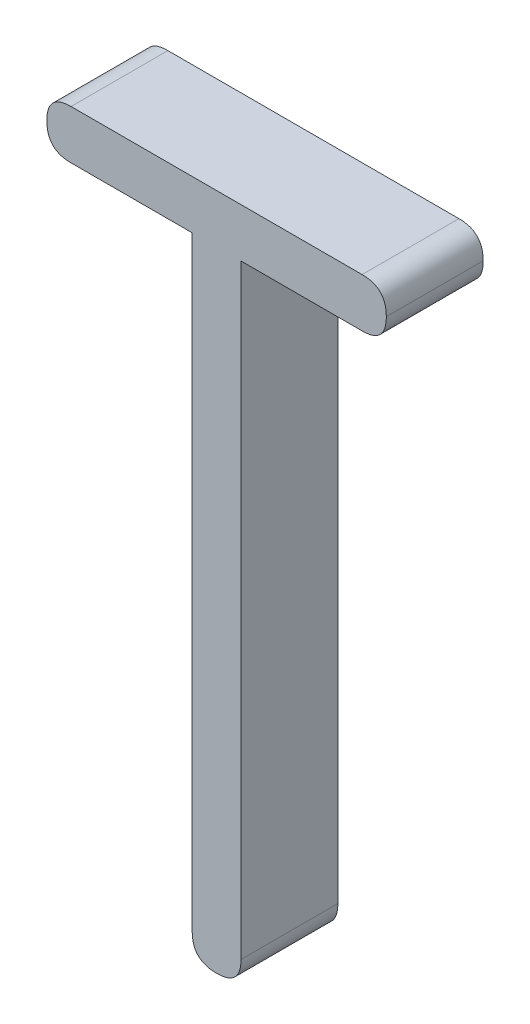
ISO-10303-21;
HEADER;
FILE_DESCRIPTION(('STEP AP214'),'2;1');
FILE_NAME('part.step','',(''),(''),'','','');
FILE_SCHEMA(('AUTOMOTIVE_DESIGN { 1 0 10303 214 1 1 1 1 }'));
ENDSEC;
DATA;
#1=APPLICATION_CONTEXT('core data for automotive mechanical design processes');
#2=APPLICATION_PROTOCOL_DEFINITION('international standard','automotive_design',2000,#1);
#3=PRODUCT_CONTEXT('',#1,'mechanical');
#4=PRODUCT('Part','Part','',(#3));
#5=PRODUCT_RELATED_PRODUCT_CATEGORY('part','',(#4));
#6=PRODUCT_DEFINITION_FORMATION('','',#4);
#7=PRODUCT_DEFINITION_CONTEXT('part definition',#1,'design');
#8=PRODUCT_DEFINITION('design','',#6,#7);
#9=PRODUCT_DEFINITION_SHAPE('','',#8);
#10=(LENGTH_UNIT() NAMED_UNIT(*) SI_UNIT(.MILLI.,.METRE.));
#11=(NAMED_UNIT(*) PLANE_ANGLE_UNIT() SI_UNIT($,.RADIAN.));
#12=(NAMED_UNIT(*) SI_UNIT($,.STERADIAN.) SOLID_ANGLE_UNIT());
#13=UNCERTAINTY_MEASURE_WITH_UNIT(LENGTH_MEASURE(1.E-05),#10,'distance_accuracy_value','');
#14=(GEOMETRIC_REPRESENTATION_CONTEXT(3) GLOBAL_UNCERTAINTY_ASSIGNED_CONTEXT((#13)) GLOBAL_UNIT_ASSIGNED_CONTEXT((#10,
#11,#12)) REPRESENTATION_CONTEXT('',''));
#15=CARTESIAN_POINT('',(0.,0.,0.));
#16=DIRECTION('',(0.,0.,1.));
#17=DIRECTION('',(1.,0.,0.));
#18=AXIS2_PLACEMENT_3D('',#15,#16,#17);
#19=CARTESIAN_POINT('',(20.9517277553988,2.3533999175906,-0.1));
#20=CARTESIAN_POINT('',(20.9517277553988,2.3785999175906,-0.1));
#21=CARTESIAN_POINT('',(20.9267202553988,2.3785999175906,-0.1));
#22=CARTESIAN_POINT('',(20.9517277553988,2.3533999175906,0.));
#23=CARTESIAN_POINT('',(20.9517277553988,2.3785999175906,0.));
#24=CARTESIAN_POINT('',(20.9267202553988,2.3785999175906,0.));
#25=B_SPLINE_SURFACE_WITH_KNOTS('',1,2,((#19,#20,#21),(#22,#23,#24)),.UNSPECIFIED.,.F.,.F.,.F.,
(2,2),(3,3),(0.,1.),(0.,1.),.UNSPECIFIED.);
#26=DIRECTION('',(0.,0.,-1.));
#27=VECTOR('',#26,1.);
#28=CARTESIAN_POINT('',(20.9517277553988,2.3533999175906,-0.05));
#29=LINE('',#28,#27);
#30=CARTESIAN_POINT('',(20.9517277553988,2.3533999175906,0.));
#31=VERTEX_POINT('',#30);
#32=CARTESIAN_POINT('',(20.9517277553988,2.3533999175906,-0.1));
#33=VERTEX_POINT('',#32);
#34=EDGE_CURVE('E111',#31,#33,#29,.T.);
#35=CARTESIAN_POINT('',(20.9517277553988,2.3533999175906,-0.1));
#36=CARTESIAN_POINT('',(20.9517188563615,2.35549240841371,-0.1));
#37=CARTESIAN_POINT('',(20.9515957631418,2.35761873987553,-0.1));
#38=CARTESIAN_POINT('',(20.9509511596031,2.36185217443173,-0.1));
#39=CARTESIAN_POINT('',(20.9504209706376,2.36395783308257,-0.1));
#40=CARTESIAN_POINT('',(20.9487923133418,2.36792403216964,-0.1));
#41=CARTESIAN_POINT('',(20.9477040424521,2.36978824360614,-0.1));
#42=CARTESIAN_POINT('',(20.9449165360134,2.37300951685075,-0.1));
#43=CARTESIAN_POINT('',(20.9432149871706,2.37436461821947,-0.1));
#44=CARTESIAN_POINT('',(20.9390808376657,2.37668119133859,-0.1));
#45=CARTESIAN_POINT('',(20.9365698138118,2.37748805054711,-0.1));
#46=CARTESIAN_POINT('',(20.9315797217488,2.37842491467146,-0.1));
#47=CARTESIAN_POINT('',(20.929108807879,2.3785947631296,-0.1));
#48=CARTESIAN_POINT('',(20.9267202553988,2.3785999175906,-0.1));
#49=B_SPLINE_CURVE_WITH_KNOTS('',3,(#35,#36,#37,#38,#39,#40,#41,#42,#43,#44,#45,#46,#47,#48),
.UNSPECIFIED.,.F.,.F.,(4,2,2,2,2,2,4),(0.,0.0063286558976897,0.0127961082036592,
0.019149386352186,0.0255268843609786,0.0333230170829277,0.0406225102328537),.UNSPECIFIED.);
#50=CARTESIAN_POINT('',(20.9267202553988,2.3785999175906,-0.1));
#51=VERTEX_POINT('',#50);
#52=EDGE_CURVE('E191',#33,#51,#49,.T.);
#53=DIRECTION('',(0.,0.,1.));
#54=VECTOR('',#53,1.);
#55=CARTESIAN_POINT('',(20.9267202553988,2.3785999175906,-0.1));
#56=LINE('',#55,#54);
#57=CARTESIAN_POINT('',(20.9267202553988,2.3785999175906,0.));
#58=VERTEX_POINT('',#57);
#59=EDGE_CURVE('E151',#58,#51,#56,.F.);
#60=CARTESIAN_POINT('',(20.9517277553988,2.3533999175906,0.));
#61=CARTESIAN_POINT('',(20.9517188563615,2.35549240841372,0.));
#62=CARTESIAN_POINT('',(20.9515957631418,2.35761873987553,0.));
#63=CARTESIAN_POINT('',(20.9509511596031,2.36185217443173,0.));
#64=CARTESIAN_POINT('',(20.9504209706376,2.36395783308257,0.));
#65=CARTESIAN_POINT('',(20.9487923133418,2.36792403216964,0.));
#66=CARTESIAN_POINT('',(20.9477040424521,2.36978824360614,0.));
#67=CARTESIAN_POINT('',(20.9449165360134,2.37300951685075,0.));
#68=CARTESIAN_POINT('',(20.9432149871706,2.37436461821947,0.));
#69=CARTESIAN_POINT('',(20.9390808376657,2.37668119133859,0.));
#70=CARTESIAN_POINT('',(20.9365698138118,2.37748805054711,0.));
#71=CARTESIAN_POINT('',(20.9315797217488,2.37842491467146,0.));
#72=CARTESIAN_POINT('',(20.929108807879,2.3785947631296,0.));
#73=CARTESIAN_POINT('',(20.9267202553988,2.3785999175906,0.));
#74=B_SPLINE_CURVE_WITH_KNOTS('',3,(#60,#61,#62,#63,#64,#65,#66,#67,#68,#69,#70,#71,#72,#73),
.UNSPECIFIED.,.F.,.F.,(4,2,2,2,2,2,4),(0.,0.00632865589769069,0.0127961082036612,
0.019149386352188,0.0255268843609806,0.0333230170829297,0.0406225102328557),.UNSPECIFIED.);
#75=EDGE_CURVE('E115',#31,#58,#74,.T.);
#76=ORIENTED_EDGE('',*,*,#34,.T.);
#77=ORIENTED_EDGE('',*,*,#52,.T.);
#78=ORIENTED_EDGE('',*,*,#59,.F.);
#79=ORIENTED_EDGE('',*,*,#75,.F.);
#80=EDGE_LOOP('',(#76,#77,#78,#79));
#81=FACE_BOUND('',#80,.T.);
#82=ADVANCED_FACE('F17',(#81),#25,.F.);
#83=CARTESIAN_POINT('',(20.9267202553988,2.3785999175906,-0.1));
#84=DIRECTION('',(0.,1.,0.));
#85=DIRECTION('',(0.,0.,1.));
#86=AXIS2_PLACEMENT_3D('',#83,#84,#85);
#87=PLANE('',#86);
#88=DIRECTION('',(1.,0.,0.));
#89=VECTOR('',#88,1.);
#90=CARTESIAN_POINT('',(0.,2.3785999175906,-0.1));
#91=LINE('',#90,#89);
#92=CARTESIAN_POINT('',(20.6261752553988,2.3785999175906,-0.1));
#93=VERTEX_POINT('',#92);
#94=EDGE_CURVE('E196',#51,#93,#91,.F.);
#95=ORIENTED_EDGE('',*,*,#94,.T.);
#96=DIRECTION('',(0.,0.,1.));
#97=VECTOR('',#96,1.);
#98=CARTESIAN_POINT('',(20.6261752553988,2.3785999175906,-0.05));
#99=LINE('',#98,#97);
#100=CARTESIAN_POINT('',(20.6261752553988,2.3785999175906,0.));
#101=VERTEX_POINT('',#100);
#102=EDGE_CURVE('E149',#93,#101,#99,.T.);
#103=ORIENTED_EDGE('',*,*,#102,.T.);
#104=DIRECTION('',(1.,0.,0.));
#105=VECTOR('',#104,1.);
#106=CARTESIAN_POINT('',(0.,2.3785999175906,0.));
#107=LINE('',#106,#105);
#108=EDGE_CURVE('E224',#58,#101,#107,.F.);
#109=ORIENTED_EDGE('',*,*,#108,.F.);
#110=ORIENTED_EDGE('',*,*,#59,.T.);
#111=EDGE_LOOP('',(#95,#103,#109,#110));
#112=FACE_BOUND('',#111,.T.);
#113=ADVANCED_FACE('F207',(#112),#87,.T.);
#114=CARTESIAN_POINT('',(20.6261752553988,2.3785999175906,-0.1));
#115=CARTESIAN_POINT('',(20.6011677553988,2.3785999175906,-0.1));
#116=CARTESIAN_POINT('',(20.6011677553988,2.3533999175906,-0.1));
#117=CARTESIAN_POINT('',(20.6261752553988,2.3785999175906,0.));
#118=CARTESIAN_POINT('',(20.6011677553988,2.3785999175906,0.));
#119=CARTESIAN_POINT('',(20.6011677553988,2.3533999175906,0.));
#120=B_SPLINE_SURFACE_WITH_KNOTS('',1,2,((#114,#115,#116),(#117,#118,#119)),.UNSPECIFIED.,.F.,
.F.,.F.,(2,2),(3,3),(0.,1.),(0.,1.),.UNSPECIFIED.);
#121=CARTESIAN_POINT('',(20.6261752553988,2.3785999175906,-0.1));
#122=CARTESIAN_POINT('',(20.6241322754824,2.37859176818425,-0.1));
#123=CARTESIAN_POINT('',(20.6220581548315,2.37847130446838,-0.1));
#124=CARTESIAN_POINT('',(20.6179293023062,2.37784575233803,-0.1));
#125=CARTESIAN_POINT('',(20.6158759011217,2.37733260848162,-0.1));
#126=CARTESIAN_POINT('',(20.6119543753392,2.37574360496876,-0.1));
#127=CARTESIAN_POINT('',(20.6100875349692,2.37466412725201,-0.1));
#128=CARTESIAN_POINT('',(20.6068581819807,2.37189321234206,-0.1));
#129=CARTESIAN_POINT('',(20.6054975685729,2.37019951677084,-0.1));
#130=CARTESIAN_POINT('',(20.6031578137197,2.36607204776629,-0.1));
#131=CARTESIAN_POINT('',(20.6023361288653,2.36355757373418,-0.1));
#132=CARTESIAN_POINT('',(20.601353110353,2.35846230530187,-0.1));
#133=CARTESIAN_POINT('',(20.6011740719858,2.35588529185247,-0.1));
#134=CARTESIAN_POINT('',(20.6011677553988,2.3533999175906,-0.1));
#135=B_SPLINE_CURVE_WITH_KNOTS('',3,(#121,#122,#123,#124,#125,#126,#127,#128,#129,#130,#131,
#132,#133,#134),.UNSPECIFIED.,.F.,.F.,(4,2,2,2,2,2,4),(0.,0.00617555295361581,
0.0124813041899388,0.0188278396858581,0.025197950950079,0.0330188630002677,0.0406225830086296),.UNSPECIFIED.);
#136=CARTESIAN_POINT('',(20.6011677553988,2.3533999175906,-0.1));
#137=VERTEX_POINT('',#136);
#138=EDGE_CURVE('E185',#93,#137,#135,.T.);
#139=DIRECTION('',(0.,0.,1.));
#140=VECTOR('',#139,1.);
#141=CARTESIAN_POINT('',(20.6011677553988,2.3533999175906,-0.05));
#142=LINE('',#141,#140);
#143=CARTESIAN_POINT('',(20.6011677553988,2.3533999175906,0.));
#144=VERTEX_POINT('',#143);
#145=EDGE_CURVE('E147',#137,#144,#142,.T.);
#146=CARTESIAN_POINT('',(20.6261752553988,2.3785999175906,0.));
#147=CARTESIAN_POINT('',(20.6241322754824,2.37859176818425,0.));
#148=CARTESIAN_POINT('',(20.6220581548315,2.37847130446838,0.));
#149=CARTESIAN_POINT('',(20.6179293023062,2.37784575233803,0.));
#150=CARTESIAN_POINT('',(20.6158759011217,2.37733260848162,0.));
#151=CARTESIAN_POINT('',(20.6119543753392,2.37574360496876,0.));
#152=CARTESIAN_POINT('',(20.6100875349692,2.37466412725201,0.));
#153=CARTESIAN_POINT('',(20.6068581819807,2.37189321234206,0.));
#154=CARTESIAN_POINT('',(20.6054975685729,2.37019951677084,0.));
#155=CARTESIAN_POINT('',(20.6031578137197,2.36607204776629,0.));
#156=CARTESIAN_POINT('',(20.6023361288653,2.36355757373418,0.));
#157=CARTESIAN_POINT('',(20.601353110353,2.35846230530187,0.));
#158=CARTESIAN_POINT('',(20.6011740719858,2.35588529185247,0.));
#159=CARTESIAN_POINT('',(20.6011677553988,2.3533999175906,0.));
#160=B_SPLINE_CURVE_WITH_KNOTS('',3,(#146,#147,#148,#149,#150,#151,#152,#153,#154,#155,#156,
#157,#158,#159),.UNSPECIFIED.,.F.,.F.,(4,2,2,2,2,2,4),(0.,0.00617555295361581,
0.0124813041899388,0.0188278396858581,0.025197950950079,0.0330188630002677,0.0406225830086296),.UNSPECIFIED.);
#161=EDGE_CURVE('E225',#101,#144,#160,.T.);
#162=ORIENTED_EDGE('',*,*,#102,.F.);
#163=ORIENTED_EDGE('',*,*,#138,.T.);
#164=ORIENTED_EDGE('',*,*,#145,.T.);
#165=ORIENTED_EDGE('',*,*,#161,.F.);
#166=EDGE_LOOP('',(#162,#163,#164,#165));
#167=FACE_BOUND('',#166,.T.);
#168=ADVANCED_FACE('F210',(#167),#120,.F.);
#169=CARTESIAN_POINT('',(20.6011677553988,2.3533999175906,-0.1));
#170=CARTESIAN_POINT('',(20.6011677553988,2.3281999175906,-0.1));
#171=CARTESIAN_POINT('',(20.6261052553988,2.3281999175906,-0.1));
#172=CARTESIAN_POINT('',(20.6011677553988,2.3533999175906,0.));
#173=CARTESIAN_POINT('',(20.6011677553988,2.3281999175906,0.));
#174=CARTESIAN_POINT('',(20.6261052553988,2.3281999175906,0.));
#175=B_SPLINE_SURFACE_WITH_KNOTS('',1,2,((#169,#170,#171),(#172,#173,#174)),.UNSPECIFIED.,.F.,
.F.,.F.,(2,2),(3,3),(0.,1.),(0.,1.),.UNSPECIFIED.);
#176=CARTESIAN_POINT('',(20.6011677553988,2.3533999175906,-0.1));
#177=CARTESIAN_POINT('',(20.6011767864963,2.35130121936063,-0.1));
#178=CARTESIAN_POINT('',(20.6013001871403,2.34916821054262,-0.1));
#179=CARTESIAN_POINT('',(20.6019474195651,2.34492135595703,-0.1));
#180=CARTESIAN_POINT('',(20.6024800371272,2.34280897447728,-0.1));
#181=CARTESIAN_POINT('',(20.6041137783035,2.33884018267279,-0.1));
#182=CARTESIAN_POINT('',(20.6052021167657,2.33697915780581,-0.1));
#183=CARTESIAN_POINT('',(20.6079886846106,2.33376405372838,-0.1));
#184=CARTESIAN_POINT('',(20.6096892336299,2.33241194317563,-0.1));
#185=CARTESIAN_POINT('',(20.6138187090784,2.33010296648838,-0.1));
#186=CARTESIAN_POINT('',(20.6163255383305,2.32929998506332,-0.1));
#187=CARTESIAN_POINT('',(20.6212894576872,2.32837279641824,-0.1));
#188=CARTESIAN_POINT('',(20.6237376721328,2.32820487092749,-0.1));
#189=CARTESIAN_POINT('',(20.6261052553988,2.3281999175906,-0.1));
#190=B_SPLINE_CURVE_WITH_KNOTS('',3,(#176,#177,#178,#179,#180,#181,#182,#183,#184,#185,#186,
#187,#188,#189),.UNSPECIFIED.,.F.,.F.,(4,2,2,2,2,2,4),(0.,0.00634808488667877,
0.0128364065694494,0.019181763416515,0.0255514200174723,0.0333319586615247,0.0405659536964663),.UNSPECIFIED.);
#191=CARTESIAN_POINT('',(20.6261052553988,2.3281999175906,-0.1));
#192=VERTEX_POINT('',#191);
#193=EDGE_CURVE('E179',#137,#192,#190,.T.);
#194=DIRECTION('',(0.,0.,-1.));
#195=VECTOR('',#194,1.);
#196=CARTESIAN_POINT('',(20.6261052553988,2.3281999175906,-0.1));
#197=LINE('',#196,#195);
#198=CARTESIAN_POINT('',(20.6261052553988,2.3281999175906,0.));
#199=VERTEX_POINT('',#198);
#200=EDGE_CURVE('E142',#199,#192,#197,.T.);
#201=CARTESIAN_POINT('',(20.6011677553988,2.3533999175906,0.));
#202=CARTESIAN_POINT('',(20.6011767864963,2.35130121936063,0.));
#203=CARTESIAN_POINT('',(20.6013001871403,2.34916821054262,0.));
#204=CARTESIAN_POINT('',(20.6019474195651,2.34492135595703,0.));
#205=CARTESIAN_POINT('',(20.6024800371272,2.34280897447728,0.));
#206=CARTESIAN_POINT('',(20.6041137783035,2.33884018267279,0.));
#207=CARTESIAN_POINT('',(20.6052021167657,2.33697915780581,0.));
#208=CARTESIAN_POINT('',(20.6079886846106,2.33376405372838,0.));
#209=CARTESIAN_POINT('',(20.6096892336299,2.33241194317563,0.));
#210=CARTESIAN_POINT('',(20.6138187090784,2.33010296648838,0.));
#211=CARTESIAN_POINT('',(20.6163255383305,2.32929998506332,0.));
#212=CARTESIAN_POINT('',(20.6212894576872,2.32837279641824,0.));
#213=CARTESIAN_POINT('',(20.6237376721328,2.32820487092749,0.));
#214=CARTESIAN_POINT('',(20.6261052553988,2.3281999175906,0.));
#215=B_SPLINE_CURVE_WITH_KNOTS('',3,(#201,#202,#203,#204,#205,#206,#207,#208,#209,#210,#211,
#212,#213,#214),.UNSPECIFIED.,.F.,.F.,(4,2,2,2,2,2,4),(0.,0.00634808488667896,0.01283640656945,
0.0191817634165157,0.025551420017473,0.0333319586615254,0.0405659536964669),.UNSPECIFIED.);
#216=EDGE_CURVE('E231',#144,#199,#215,.T.);
#217=ORIENTED_EDGE('',*,*,#145,.F.);
#218=ORIENTED_EDGE('',*,*,#193,.T.);
#219=ORIENTED_EDGE('',*,*,#200,.F.);
#220=ORIENTED_EDGE('',*,*,#216,.F.);
#221=EDGE_LOOP('',(#217,#218,#219,#220));
#222=FACE_BOUND('',#221,.T.);
#223=ADVANCED_FACE('F241',(#222),#175,.F.);
#224=CARTESIAN_POINT('',(20.6261052553988,2.3281999175906,-0.1));
#225=DIRECTION('',(0.,-1.,0.));
#226=DIRECTION('',(0.,0.,-1.));
#227=AXIS2_PLACEMENT_3D('',#224,#225,#226);
#228=PLANE('',#227);
#229=DIRECTION('',(1.,0.,0.));
#230=VECTOR('',#229,1.);
#231=CARTESIAN_POINT('',(0.,2.3281999175906,-0.1));
#232=LINE('',#231,#230);
#233=CARTESIAN_POINT('',(20.7512477553988,2.3281999175906,-0.1));
#234=VERTEX_POINT('',#233);
#235=EDGE_CURVE('E327',#192,#234,#232,.T.);
#236=ORIENTED_EDGE('',*,*,#235,.T.);
#237=DIRECTION('',(0.,0.,1.));
#238=VECTOR('',#237,1.);
#239=CARTESIAN_POINT('',(20.7512477553988,2.3281999175906,-0.1));
#240=LINE('',#239,#238);
#241=CARTESIAN_POINT('',(20.7512477553988,2.3281999175906,0.));
#242=VERTEX_POINT('',#241);
#243=EDGE_CURVE('E139',#242,#234,#240,.F.);
#244=ORIENTED_EDGE('',*,*,#243,.F.);
#245=DIRECTION('',(1.,0.,0.));
#246=VECTOR('',#245,1.);
#247=CARTESIAN_POINT('',(0.,2.3281999175906,0.));
#248=LINE('',#247,#246);
#249=EDGE_CURVE('E237',#199,#242,#248,.T.);
#250=ORIENTED_EDGE('',*,*,#249,.F.);
#251=ORIENTED_EDGE('',*,*,#200,.T.);
#252=EDGE_LOOP('',(#236,#244,#250,#251));
#253=FACE_BOUND('',#252,.T.);
#254=ADVANCED_FACE('F246',(#253),#228,.T.);
#255=CARTESIAN_POINT('',(20.7512477553988,2.3281999175906,-0.1));
#256=DIRECTION('',(-1.,0.,0.));
#257=DIRECTION('',(0.,0.,1.));
#258=AXIS2_PLACEMENT_3D('',#255,#256,#257);
#259=PLANE('',#258);
#260=DIRECTION('',(0.,1.,0.));
#261=VECTOR('',#260,1.);
#262=CARTESIAN_POINT('',(20.7512477553988,0.,-0.1));
#263=LINE('',#262,#261);
#264=CARTESIAN_POINT('',(20.7512477553988,1.7035899175906,-0.1));
#265=VERTEX_POINT('',#264);
#266=EDGE_CURVE('E332',#234,#265,#263,.F.);
#267=ORIENTED_EDGE('',*,*,#266,.T.);
#268=DIRECTION('',(0.,0.,1.));
#269=VECTOR('',#268,1.);
#270=CARTESIAN_POINT('',(20.7512477553988,1.7035899175906,-0.05));
#271=LINE('',#270,#269);
#272=CARTESIAN_POINT('',(20.7512477553988,1.7035899175906,0.));
#273=VERTEX_POINT('',#272);
#274=EDGE_CURVE('E137',#265,#273,#271,.T.);
#275=ORIENTED_EDGE('',*,*,#274,.T.);
#276=DIRECTION('',(0.,1.,0.));
#277=VECTOR('',#276,1.);
#278=CARTESIAN_POINT('',(20.7512477553988,0.,0.));
#279=LINE('',#278,#277);
#280=EDGE_CURVE('E303',#242,#273,#279,.F.);
#281=ORIENTED_EDGE('',*,*,#280,.F.);
#282=ORIENTED_EDGE('',*,*,#243,.T.);
#283=EDGE_LOOP('',(#267,#275,#281,#282));
#284=FACE_BOUND('',#283,.T.);
#285=ADVANCED_FACE('F259',(#284),#259,.T.);
#286=CARTESIAN_POINT('',(20.7512477553988,1.7035899175906,-0.1));
#287=CARTESIAN_POINT('',(20.7512477553988,1.6785999175906,-0.1));
#288=CARTESIAN_POINT('',(20.7764477553988,1.6785999175906,-0.1));
#289=CARTESIAN_POINT('',(20.7512477553988,1.7035899175906,0.));
#290=CARTESIAN_POINT('',(20.7512477553988,1.6785999175906,0.));
#291=CARTESIAN_POINT('',(20.7764477553988,1.6785999175906,0.));
#292=B_SPLINE_SURFACE_WITH_KNOTS('',1,2,((#286,#287,#288),(#289,#290,#291)),.UNSPECIFIED.,.F.,
.F.,.F.,(2,2),(3,3),(0.,1.),(0.,1.),.UNSPECIFIED.);
#293=CARTESIAN_POINT('',(20.7512477553988,1.7035899175906,-0.1));
#294=CARTESIAN_POINT('',(20.7512558693878,1.7015498893279,-0.1));
#295=CARTESIAN_POINT('',(20.7513761709987,1.6994788491768,-0.1));
#296=CARTESIAN_POINT('',(20.752000646894,1.69535615628181,-0.1));
#297=CARTESIAN_POINT('',(20.7525128465457,1.69330582880643,-0.1));
#298=CARTESIAN_POINT('',(20.7540995122263,1.68938771504422,-0.1));
#299=CARTESIAN_POINT('',(20.7551782079979,1.68752142914264,-0.1));
#300=CARTESIAN_POINT('',(20.7579473821896,1.68429287782701,-0.1));
#301=CARTESIAN_POINT('',(20.7596401155965,1.68293250811998,-0.1));
#302=CARTESIAN_POINT('',(20.7637658122251,1.68059254093057,-0.1));
#303=CARTESIAN_POINT('',(20.7662795528121,1.67977047631339,-0.1));
#304=CARTESIAN_POINT('',(20.7713778403898,1.67878568225118,-0.1));
#305=CARTESIAN_POINT('',(20.7739588220405,1.67860628918776,-0.1));
#306=CARTESIAN_POINT('',(20.7764477553988,1.6785999175906,-0.1));
#307=B_SPLINE_CURVE_WITH_KNOTS('',3,(#293,#294,#295,#296,#297,#298,#299,#300,#301,#302,#303,
#304,#305,#306),.UNSPECIFIED.,.F.,.F.,(4,2,2,2,2,2,4),(0.,0.00616648259272471,
0.0124627395857372,0.0188066903326243,0.0251741784016736,0.0329934495469082,0.0406084478282393),.UNSPECIFIED.);
#308=CARTESIAN_POINT('',(20.7764477553988,1.6785999175906,-0.1));
#309=VERTEX_POINT('',#308);
#310=EDGE_CURVE('E160',#265,#309,#307,.T.);
#311=DIRECTION('',(0.,0.,1.));
#312=VECTOR('',#311,1.);
#313=CARTESIAN_POINT('',(20.7764477553988,1.6785999175906,-0.05));
#314=LINE('',#313,#312);
#315=CARTESIAN_POINT('',(20.7764477553988,1.6785999175906,0.));
#316=VERTEX_POINT('',#315);
#317=EDGE_CURVE('E133',#309,#316,#314,.T.);
#318=CARTESIAN_POINT('',(20.7512477553988,1.7035899175906,0.));
#319=CARTESIAN_POINT('',(20.7512558693878,1.7015498893279,0.));
#320=CARTESIAN_POINT('',(20.7513761709987,1.6994788491768,0.));
#321=CARTESIAN_POINT('',(20.752000646894,1.69535615628181,0.));
#322=CARTESIAN_POINT('',(20.7525128465457,1.69330582880643,0.));
#323=CARTESIAN_POINT('',(20.7540995122263,1.68938771504422,0.));
#324=CARTESIAN_POINT('',(20.7551782079979,1.68752142914264,0.));
#325=CARTESIAN_POINT('',(20.7579473821896,1.68429287782701,0.));
#326=CARTESIAN_POINT('',(20.7596401155965,1.68293250811998,0.));
#327=CARTESIAN_POINT('',(20.7637658122251,1.68059254093057,0.));
#328=CARTESIAN_POINT('',(20.7662795528121,1.67977047631339,0.));
#329=CARTESIAN_POINT('',(20.7713778403898,1.67878568225118,0.));
#330=CARTESIAN_POINT('',(20.7739588220405,1.67860628918776,0.));
#331=CARTESIAN_POINT('',(20.7764477553988,1.6785999175906,0.));
#332=B_SPLINE_CURVE_WITH_KNOTS('',3,(#318,#319,#320,#321,#322,#323,#324,#325,#326,#327,#328,
#329,#330,#331),.UNSPECIFIED.,.F.,.F.,(4,2,2,2,2,2,4),(0.,0.00616648259272471,
0.0124627395857372,0.0188066903326243,0.0251741784016736,0.0329934495469082,0.0406084478282393),.UNSPECIFIED.);
#333=EDGE_CURVE('E136',#273,#316,#332,.T.);
#334=ORIENTED_EDGE('',*,*,#274,.F.);
#335=ORIENTED_EDGE('',*,*,#310,.T.);
#336=ORIENTED_EDGE('',*,*,#317,.T.);
#337=ORIENTED_EDGE('',*,*,#333,.F.);
#338=EDGE_LOOP('',(#334,#335,#336,#337));
#339=FACE_BOUND('',#338,.T.);
#340=ADVANCED_FACE('F248',(#339),#292,.F.);
#341=CARTESIAN_POINT('',(20.9267202553988,2.3281999175906,-0.1));
#342=CARTESIAN_POINT('',(20.9517277553988,2.3281999175906,-0.1));
#343=CARTESIAN_POINT('',(20.9517277553988,2.3533999175906,-0.1));
#344=CARTESIAN_POINT('',(20.9267202553988,2.3281999175906,0.));
#345=CARTESIAN_POINT('',(20.9517277553988,2.3281999175906,0.));
#346=CARTESIAN_POINT('',(20.9517277553988,2.3533999175906,0.));
#347=B_SPLINE_SURFACE_WITH_KNOTS('',1,2,((#341,#342,#343),(#344,#345,#346)),.UNSPECIFIED.,.F.,
.F.,.F.,(2,2),(3,3),(0.,1.),(0.,1.),.UNSPECIFIED.);
#348=DIRECTION('',(0.,0.,-1.));
#349=VECTOR('',#348,1.);
#350=CARTESIAN_POINT('',(20.9267202553988,2.3281999175906,-0.1));
#351=LINE('',#350,#349);
#352=CARTESIAN_POINT('',(20.9267202553988,2.3281999175906,-0.1));
#353=VERTEX_POINT('',#352);
#354=CARTESIAN_POINT('',(20.9267202553988,2.3281999175906,0.));
#355=VERTEX_POINT('',#354);
#356=EDGE_CURVE('E110',#353,#355,#351,.F.);
#357=CARTESIAN_POINT('',(20.9267202553988,2.3281999175906,-0.1));
#358=CARTESIAN_POINT('',(20.9287632353152,2.32820806699695,-0.1));
#359=CARTESIAN_POINT('',(20.9308373559661,2.32832853071282,-0.1));
#360=CARTESIAN_POINT('',(20.9349662084914,2.32895408284317,-0.1));
#361=CARTESIAN_POINT('',(20.9370196096759,2.32946722669958,-0.1));
#362=CARTESIAN_POINT('',(20.9409411354584,2.33105623021245,-0.1));
#363=CARTESIAN_POINT('',(20.9428079758284,2.33213570792919,-0.1));
#364=CARTESIAN_POINT('',(20.9460373288169,2.33490662283914,-0.1));
#365=CARTESIAN_POINT('',(20.9473979422247,2.33660031841036,-0.1));
#366=CARTESIAN_POINT('',(20.9497376970779,2.3407277874149,-0.1));
#367=CARTESIAN_POINT('',(20.9505593819323,2.343242261447,-0.1));
#368=CARTESIAN_POINT('',(20.9515424004446,2.34833752987932,-0.1));
#369=CARTESIAN_POINT('',(20.9517214388117,2.35091454332873,-0.1));
#370=CARTESIAN_POINT('',(20.9517277553988,2.3533999175906,-0.1));
#371=B_SPLINE_CURVE_WITH_KNOTS('',3,(#357,#358,#359,#360,#361,#362,#363,#364,#365,#366,#367,
#368,#369,#370),.UNSPECIFIED.,.F.,.F.,(4,2,2,2,2,2,4),(0.,0.00617555295362276,
0.0124813041899424,0.0188278396858594,0.0251979509500741,0.033018863000253,0.0406225830086276),.UNSPECIFIED.);
#372=EDGE_CURVE('E197',#353,#33,#371,.T.);
#373=CARTESIAN_POINT('',(20.9267202553988,2.3281999175906,0.));
#374=CARTESIAN_POINT('',(20.9287632353152,2.32820806699695,0.));
#375=CARTESIAN_POINT('',(20.9308373559661,2.32832853071282,0.));
#376=CARTESIAN_POINT('',(20.9349662084914,2.32895408284317,0.));
#377=CARTESIAN_POINT('',(20.9370196096759,2.32946722669958,0.));
#378=CARTESIAN_POINT('',(20.9409411354584,2.33105623021245,0.));
#379=CARTESIAN_POINT('',(20.9428079758284,2.33213570792919,0.));
#380=CARTESIAN_POINT('',(20.9460373288169,2.33490662283914,0.));
#381=CARTESIAN_POINT('',(20.9473979422247,2.33660031841036,0.));
#382=CARTESIAN_POINT('',(20.9497376970779,2.3407277874149,0.));
#383=CARTESIAN_POINT('',(20.9505593819323,2.343242261447,0.));
#384=CARTESIAN_POINT('',(20.9515424004446,2.34833752987932,0.));
#385=CARTESIAN_POINT('',(20.9517214388117,2.35091454332873,0.));
#386=CARTESIAN_POINT('',(20.9517277553988,2.3533999175906,0.));
#387=B_SPLINE_CURVE_WITH_KNOTS('',3,(#373,#374,#375,#376,#377,#378,#379,#380,#381,#382,#383,
#384,#385,#386),.UNSPECIFIED.,.F.,.F.,(4,2,2,2,2,2,4),(0.,0.00617555295362276,
0.0124813041899424,0.0188278396858594,0.0251979509500741,0.033018863000253,0.0406225830086276),.UNSPECIFIED.);
#388=EDGE_CURVE('E24',#355,#31,#387,.T.);
#389=ORIENTED_EDGE('',*,*,#356,.F.);
#390=ORIENTED_EDGE('',*,*,#372,.T.);
#391=ORIENTED_EDGE('',*,*,#34,.F.);
#392=ORIENTED_EDGE('',*,*,#388,.F.);
#393=EDGE_LOOP('',(#389,#390,#391,#392));
#394=FACE_BOUND('',#393,.T.);
#395=ADVANCED_FACE('F107',(#394),#347,.F.);
#396=CARTESIAN_POINT('',(0.,0.,0.));
#397=DIRECTION('',(0.,0.,1.));
#398=DIRECTION('',(1.,0.,0.));
#399=AXIS2_PLACEMENT_3D('',#396,#397,#398);
#400=PLANE('',#399);
#401=ORIENTED_EDGE('',*,*,#333,.T.);
#402=CARTESIAN_POINT('',(20.7764477553988,1.6785999175906,0.));
#403=CARTESIAN_POINT('',(20.77854179552,1.67860884941416,0.));
#404=CARTESIAN_POINT('',(20.7806697930405,1.6787320195222,0.));
#405=CARTESIAN_POINT('',(20.784906575763,1.67937727881544,0.));
#406=CARTESIAN_POINT('',(20.7870139115933,1.67990807326646,0.));
#407=CARTESIAN_POINT('',(20.7909807597734,1.68153799807742,0.));
#408=CARTESIAN_POINT('',(20.7928441776937,1.68262628643588,0.));
#409=CARTESIAN_POINT('',(20.7960639145627,1.68541356054683,0.));
#410=CARTESIAN_POINT('',(20.7974182710108,1.68711486119212,0.));
#411=CARTESIAN_POINT('',(20.7997329489624,1.69124784590037,0.));
#412=CARTESIAN_POINT('',(20.8005388400932,1.69375782292372,0.));
#413=CARTESIAN_POINT('',(20.8014732837827,1.6987413723983,0.));
#414=CARTESIAN_POINT('',(20.8016426517268,1.70120660830964,0.));
#415=CARTESIAN_POINT('',(20.8016477553988,1.7035899175906,0.));
#416=B_SPLINE_CURVE_WITH_KNOTS('',3,(#402,#403,#404,#405,#406,#407,#408,#409,#410,#411,#412,
#413,#414,#415),.UNSPECIFIED.,.F.,.F.,(4,2,2,2,2,2,4),(0.,0.00633350416974901,
0.0128061629194577,0.0191574692673796,0.0255330155642496,0.0333252555174488,0.0406083684014832),.UNSPECIFIED.);
#417=CARTESIAN_POINT('',(20.8016477553988,1.7035899175906,0.));
#418=VERTEX_POINT('',#417);
#419=EDGE_CURVE('E135',#316,#418,#416,.T.);
#420=ORIENTED_EDGE('',*,*,#419,.T.);
#421=DIRECTION('',(0.,1.,0.));
#422=VECTOR('',#421,1.);
#423=CARTESIAN_POINT('',(20.8016477553988,1.7035899175906,0.));
#424=LINE('',#423,#422);
#425=CARTESIAN_POINT('',(20.8016477553988,2.3281999175906,0.));
#426=VERTEX_POINT('',#425);
#427=EDGE_CURVE('E121',#426,#418,#424,.F.);
#428=ORIENTED_EDGE('',*,*,#427,.F.);
#429=DIRECTION('',(1.,0.,0.));
#430=VECTOR('',#429,1.);
#431=CARTESIAN_POINT('',(20.8016477553988,2.3281999175906,0.));
#432=LINE('',#431,#430);
#433=EDGE_CURVE('E117',#355,#426,#432,.F.);
#434=ORIENTED_EDGE('',*,*,#433,.F.);
#435=ORIENTED_EDGE('',*,*,#388,.T.);
#436=ORIENTED_EDGE('',*,*,#75,.T.);
#437=ORIENTED_EDGE('',*,*,#108,.T.);
#438=ORIENTED_EDGE('',*,*,#161,.T.);
#439=ORIENTED_EDGE('',*,*,#216,.T.);
#440=ORIENTED_EDGE('',*,*,#249,.T.);
#441=ORIENTED_EDGE('',*,*,#280,.T.);
#442=EDGE_LOOP('',(#401,#420,#428,#434,#435,#436,#437,#438,#439,#440,#441));
#443=FACE_BOUND('',#442,.T.);
#444=ADVANCED_FACE('F119',(#443),#400,.T.);
#445=CARTESIAN_POINT('',(20.7764477553988,1.6785999175906,-0.1));
#446=CARTESIAN_POINT('',(20.8016477553988,1.6785999175906,-0.1));
#447=CARTESIAN_POINT('',(20.8016477553988,1.7035899175906,-0.1));
#448=CARTESIAN_POINT('',(20.7764477553988,1.6785999175906,0.));
#449=CARTESIAN_POINT('',(20.8016477553988,1.6785999175906,0.));
#450=CARTESIAN_POINT('',(20.8016477553988,1.7035899175906,0.));
#451=B_SPLINE_SURFACE_WITH_KNOTS('',1,2,((#445,#446,#447),(#448,#449,#450)),.UNSPECIFIED.,.F.,
.F.,.F.,(2,2),(3,3),(0.,1.),(0.,1.),.UNSPECIFIED.);
#452=CARTESIAN_POINT('',(20.7764477553988,1.6785999175906,-0.1));
#453=CARTESIAN_POINT('',(20.77854179552,1.67860884941416,-0.1));
#454=CARTESIAN_POINT('',(20.7806697930405,1.6787320195222,-0.1));
#455=CARTESIAN_POINT('',(20.784906575763,1.67937727881544,-0.1));
#456=CARTESIAN_POINT('',(20.7870139115933,1.67990807326646,-0.1));
#457=CARTESIAN_POINT('',(20.7909807597734,1.68153799807742,-0.1));
#458=CARTESIAN_POINT('',(20.7928441776937,1.68262628643588,-0.1));
#459=CARTESIAN_POINT('',(20.7960639145627,1.68541356054683,-0.1));
#460=CARTESIAN_POINT('',(20.7974182710108,1.68711486119212,-0.1));
#461=CARTESIAN_POINT('',(20.7997329489624,1.69124784590037,-0.1));
#462=CARTESIAN_POINT('',(20.8005388400932,1.69375782292372,-0.1));
#463=CARTESIAN_POINT('',(20.8014732837827,1.6987413723983,-0.1));
#464=CARTESIAN_POINT('',(20.8016426517268,1.70120660830964,-0.1));
#465=CARTESIAN_POINT('',(20.8016477553988,1.7035899175906,-0.1));
#466=B_SPLINE_CURVE_WITH_KNOTS('',3,(#452,#453,#454,#455,#456,#457,#458,#459,#460,#461,#462,
#463,#464,#465),.UNSPECIFIED.,.F.,.F.,(4,2,2,2,2,2,4),(0.,0.00633350416974901,
0.0128061629194577,0.0191574692673796,0.0255330155642496,0.0333252555174488,0.0406083684014832),.UNSPECIFIED.);
#467=CARTESIAN_POINT('',(20.8016477553988,1.7035899175906,-0.1));
#468=VERTEX_POINT('',#467);
#469=EDGE_CURVE('E123',#309,#468,#466,.T.);
#470=DIRECTION('',(0.,0.,-1.));
#471=VECTOR('',#470,1.);
#472=CARTESIAN_POINT('',(20.8016477553988,1.7035899175906,-0.1));
#473=LINE('',#472,#471);
#474=EDGE_CURVE('E127',#418,#468,#473,.T.);
#475=ORIENTED_EDGE('',*,*,#317,.F.);
#476=ORIENTED_EDGE('',*,*,#469,.T.);
#477=ORIENTED_EDGE('',*,*,#474,.F.);
#478=ORIENTED_EDGE('',*,*,#419,.F.);
#479=EDGE_LOOP('',(#475,#476,#477,#478));
#480=FACE_BOUND('',#479,.T.);
#481=ADVANCED_FACE('F19',(#480),#451,.F.);
#482=CARTESIAN_POINT('',(0.,0.,-0.1));
#483=DIRECTION('',(0.,0.,1.));
#484=DIRECTION('',(1.,0.,0.));
#485=AXIS2_PLACEMENT_3D('',#482,#483,#484);
#486=PLANE('',#485);
#487=ORIENTED_EDGE('',*,*,#469,.F.);
#488=ORIENTED_EDGE('',*,*,#310,.F.);
#489=ORIENTED_EDGE('',*,*,#266,.F.);
#490=ORIENTED_EDGE('',*,*,#235,.F.);
#491=ORIENTED_EDGE('',*,*,#193,.F.);
#492=ORIENTED_EDGE('',*,*,#138,.F.);
#493=ORIENTED_EDGE('',*,*,#94,.F.);
#494=ORIENTED_EDGE('',*,*,#52,.F.);
#495=ORIENTED_EDGE('',*,*,#372,.F.);
#496=DIRECTION('',(1.,0.,0.));
#497=VECTOR('',#496,1.);
#498=CARTESIAN_POINT('',(20.8016477553988,2.3281999175906,-0.1));
#499=LINE('',#498,#497);
#500=CARTESIAN_POINT('',(20.8016477553988,2.3281999175906,-0.1));
#501=VERTEX_POINT('',#500);
#502=EDGE_CURVE('E43',#501,#353,#499,.T.);
#503=ORIENTED_EDGE('',*,*,#502,.F.);
#504=DIRECTION('',(0.,1.,0.));
#505=VECTOR('',#504,1.);
#506=CARTESIAN_POINT('',(20.8016477553988,1.7035899175906,-0.1));
#507=LINE('',#506,#505);
#508=EDGE_CURVE('E34',#468,#501,#507,.T.);
#509=ORIENTED_EDGE('',*,*,#508,.F.);
#510=EDGE_LOOP('',(#487,#488,#489,#490,#491,#492,#493,#494,#495,#503,#509));
#511=FACE_BOUND('',#510,.T.);
#512=ADVANCED_FACE('F166',(#511),#486,.F.);
#513=CARTESIAN_POINT('',(20.8016477553988,2.3281999175906,-0.1));
#514=DIRECTION('',(0.,-1.,0.));
#515=DIRECTION('',(0.,0.,-1.));
#516=AXIS2_PLACEMENT_3D('',#513,#514,#515);
#517=PLANE('',#516);
#518=ORIENTED_EDGE('',*,*,#502,.T.);
#519=ORIENTED_EDGE('',*,*,#356,.T.);
#520=ORIENTED_EDGE('',*,*,#433,.T.);
#521=DIRECTION('',(0.,0.,-1.));
#522=VECTOR('',#521,1.);
#523=CARTESIAN_POINT('',(20.8016477553988,2.3281999175906,-0.1));
#524=LINE('',#523,#522);
#525=EDGE_CURVE('E11',#501,#426,#524,.F.);
#526=ORIENTED_EDGE('',*,*,#525,.F.);
#527=EDGE_LOOP('',(#518,#519,#520,#526));
#528=FACE_BOUND('',#527,.T.);
#529=ADVANCED_FACE('F125',(#528),#517,.T.);
#530=CARTESIAN_POINT('',(20.8016477553988,1.7035899175906,-0.1));
#531=DIRECTION('',(1.,0.,0.));
#532=DIRECTION('',(0.,0.,-1.));
#533=AXIS2_PLACEMENT_3D('',#530,#531,#532);
#534=PLANE('',#533);
#535=ORIENTED_EDGE('',*,*,#508,.T.);
#536=ORIENTED_EDGE('',*,*,#525,.T.);
#537=ORIENTED_EDGE('',*,*,#427,.T.);
#538=ORIENTED_EDGE('',*,*,#474,.T.);
#539=EDGE_LOOP('',(#535,#536,#537,#538));
#540=FACE_BOUND('',#539,.T.);
#541=ADVANCED_FACE('F281',(#540),#534,.T.);
#542=CLOSED_SHELL('',(#82,#113,#168,#223,#254,#285,#340,#395,#444,#481,#512,#529,#541));
#543=MANIFOLD_SOLID_BREP('B1',#542);
#544=ADVANCED_BREP_SHAPE_REPRESENTATION('',(#18,#543),#14);
#545=SHAPE_DEFINITION_REPRESENTATION(#9,#544);
ENDSEC;
END-ISO-10303-21;
